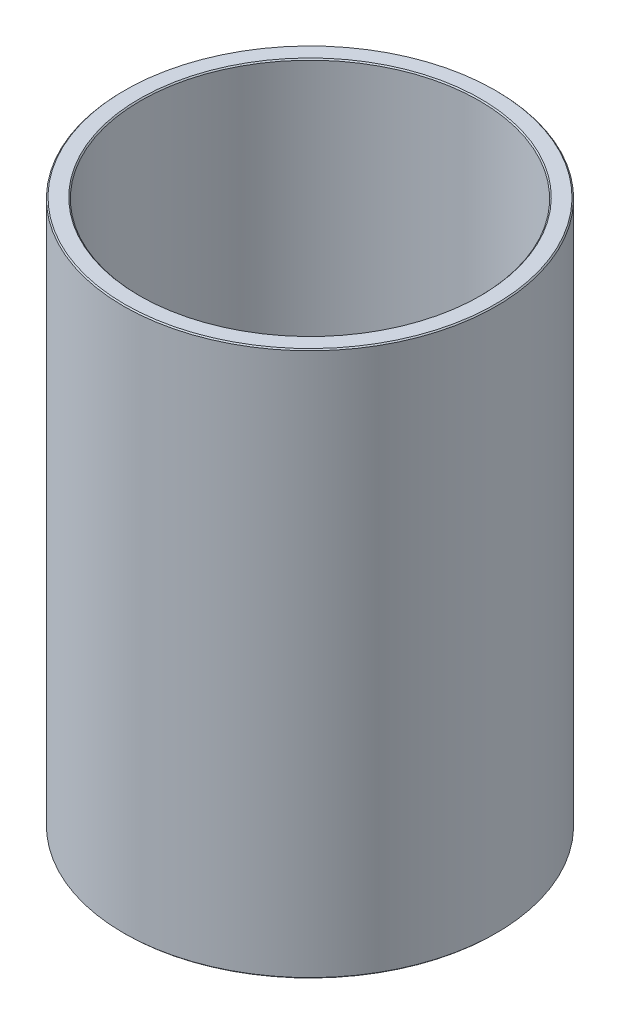
ISO-10303-21;
HEADER;
FILE_DESCRIPTION(('STEP AP214'),'2;1');
FILE_NAME('part.step','',(''),(''),'','','');
FILE_SCHEMA(('AUTOMOTIVE_DESIGN { 1 0 10303 214 1 1 1 1 }'));
ENDSEC;
DATA;
#1=APPLICATION_CONTEXT('core data for automotive mechanical design processes');
#2=APPLICATION_PROTOCOL_DEFINITION('international standard','automotive_design',2000,#1);
#3=PRODUCT_CONTEXT('',#1,'mechanical');
#4=PRODUCT('Part','Part','',(#3));
#5=PRODUCT_RELATED_PRODUCT_CATEGORY('part','',(#4));
#6=PRODUCT_DEFINITION_FORMATION('','',#4);
#7=PRODUCT_DEFINITION_CONTEXT('part definition',#1,'design');
#8=PRODUCT_DEFINITION('design','',#6,#7);
#9=PRODUCT_DEFINITION_SHAPE('','',#8);
#10=(LENGTH_UNIT() NAMED_UNIT(*) SI_UNIT(.MILLI.,.METRE.));
#11=(NAMED_UNIT(*) PLANE_ANGLE_UNIT() SI_UNIT($,.RADIAN.));
#12=(NAMED_UNIT(*) SI_UNIT($,.STERADIAN.) SOLID_ANGLE_UNIT());
#13=UNCERTAINTY_MEASURE_WITH_UNIT(LENGTH_MEASURE(1.E-05),#10,'distance_accuracy_value','');
#14=(GEOMETRIC_REPRESENTATION_CONTEXT(3) GLOBAL_UNCERTAINTY_ASSIGNED_CONTEXT((#13)) GLOBAL_UNIT_ASSIGNED_CONTEXT((#10,
#11,#12)) REPRESENTATION_CONTEXT('',''));
#15=CARTESIAN_POINT('',(0.,0.,0.));
#16=DIRECTION('',(0.,0.,1.));
#17=DIRECTION('',(1.,0.,0.));
#18=AXIS2_PLACEMENT_3D('',#15,#16,#17);
#19=CARTESIAN_POINT('',(30.,0.,0.));
#20=DIRECTION('',(0.,-1.,0.));
#21=DIRECTION('',(0.,0.,-1.));
#22=AXIS2_PLACEMENT_3D('',#19,#20,#21);
#23=PLANE('',#22);
#24=CARTESIAN_POINT('',(0.,0.,0.));
#25=DIRECTION('',(0.,-1.,0.));
#26=DIRECTION('',(0.,0.,-1.));
#27=AXIS2_PLACEMENT_3D('',#24,#25,#26);
#28=CIRCLE('',#27,30.2);
#29=CARTESIAN_POINT('',(0.,0.,-30.2));
#30=VERTEX_POINT('',#29);
#31=EDGE_CURVE('E62',#30,#30,#28,.F.);
#32=ORIENTED_EDGE('',*,*,#31,.T.);
#33=EDGE_LOOP('',(#32));
#34=FACE_BOUND('',#33,.T.);
#35=CARTESIAN_POINT('',(0.,0.,0.));
#36=DIRECTION('',(0.,-1.,0.));
#37=DIRECTION('',(0.,0.,-1.));
#38=AXIS2_PLACEMENT_3D('',#35,#36,#37);
#39=CIRCLE('',#38,32.8);
#40=CARTESIAN_POINT('',(0.,0.,-32.8));
#41=VERTEX_POINT('',#40);
#42=EDGE_CURVE('E65',#41,#41,#39,.T.);
#43=ORIENTED_EDGE('',*,*,#42,.T.);
#44=EDGE_LOOP('',(#43));
#45=FACE_BOUND('',#44,.T.);
#46=ADVANCED_FACE('F41',(#34,#45),#23,.T.);
#47=CARTESIAN_POINT('',(0.,0.,0.));
#48=DIRECTION('',(0.,-1.,0.));
#49=DIRECTION('',(0.,0.,-1.));
#50=AXIS2_PLACEMENT_3D('',#47,#48,#49);
#51=CYLINDRICAL_SURFACE('',#50,33.);
#52=CARTESIAN_POINT('',(0.,0.199999999999978,0.));
#53=DIRECTION('',(0.,-1.,0.));
#54=DIRECTION('',(0.,0.,-1.));
#55=AXIS2_PLACEMENT_3D('',#52,#53,#54);
#56=CIRCLE('',#55,33.);
#57=CARTESIAN_POINT('',(0.,0.199999999999978,-33.));
#58=VERTEX_POINT('',#57);
#59=EDGE_CURVE('E53',#58,#58,#56,.F.);
#60=CARTESIAN_POINT('',(0.,96.3,0.));
#61=DIRECTION('',(0.,1.,0.));
#62=DIRECTION('',(0.,0.,1.));
#63=AXIS2_PLACEMENT_3D('',#60,#61,#62);
#64=CIRCLE('',#63,33.);
#65=CARTESIAN_POINT('',(0.,96.3,-33.));
#66=VERTEX_POINT('',#65);
#67=EDGE_CURVE('E57',#66,#66,#64,.F.);
#68=CARTESIAN_POINT('',(0.,0.199999999999978,-33.));
#69=CARTESIAN_POINT('',(0.,1.20104166666665,-33.));
#70=CARTESIAN_POINT('',(0.,2.20208333333331,-33.));
#71=CARTESIAN_POINT('',(0.,4.20416666666665,-33.));
#72=CARTESIAN_POINT('',(0.,5.20520833333331,-33.));
#73=CARTESIAN_POINT('',(0.,7.20729166666665,-33.));
#74=CARTESIAN_POINT('',(0.,8.20833333333331,-33.));
#75=CARTESIAN_POINT('',(0.,10.2104166666666,-33.));
#76=CARTESIAN_POINT('',(0.,11.2114583333333,-33.));
#77=CARTESIAN_POINT('',(0.,13.2135416666667,-33.));
#78=CARTESIAN_POINT('',(0.,14.2145833333333,-33.));
#79=CARTESIAN_POINT('',(0.,16.2166666666667,-33.));
#80=CARTESIAN_POINT('',(0.,17.2177083333333,-33.));
#81=CARTESIAN_POINT('',(0.,19.2197916666667,-33.));
#82=CARTESIAN_POINT('',(0.,20.2208333333333,-33.));
#83=CARTESIAN_POINT('',(0.,22.2229166666667,-33.));
#84=CARTESIAN_POINT('',(0.,23.2239583333333,-33.));
#85=CARTESIAN_POINT('',(0.,25.2260416666667,-33.));
#86=CARTESIAN_POINT('',(0.,26.2270833333333,-33.));
#87=CARTESIAN_POINT('',(0.,28.2291666666667,-33.));
#88=CARTESIAN_POINT('',(0.,29.2302083333333,-33.));
#89=CARTESIAN_POINT('',(0.,31.2322916666667,-33.));
#90=CARTESIAN_POINT('',(0.,32.2333333333333,-33.));
#91=CARTESIAN_POINT('',(0.,34.2354166666667,-33.));
#92=CARTESIAN_POINT('',(0.,35.2364583333333,-33.));
#93=CARTESIAN_POINT('',(0.,37.2385416666667,-33.));
#94=CARTESIAN_POINT('',(0.,38.2395833333333,-33.));
#95=CARTESIAN_POINT('',(0.,40.2416666666667,-33.));
#96=CARTESIAN_POINT('',(0.,41.2427083333333,-33.));
#97=CARTESIAN_POINT('',(0.,43.2447916666667,-33.));
#98=CARTESIAN_POINT('',(0.,44.2458333333333,-33.));
#99=CARTESIAN_POINT('',(0.,46.2479166666667,-33.));
#100=CARTESIAN_POINT('',(0.,47.2489583333333,-33.));
#101=CARTESIAN_POINT('',(0.,49.2510416666667,-33.));
#102=CARTESIAN_POINT('',(0.,50.2520833333333,-33.));
#103=CARTESIAN_POINT('',(0.,52.2541666666667,-33.));
#104=CARTESIAN_POINT('',(0.,53.2552083333333,-33.));
#105=CARTESIAN_POINT('',(0.,55.2572916666667,-33.));
#106=CARTESIAN_POINT('',(0.,56.2583333333333,-33.));
#107=CARTESIAN_POINT('',(0.,58.2604166666667,-33.));
#108=CARTESIAN_POINT('',(0.,59.2614583333333,-33.));
#109=CARTESIAN_POINT('',(0.,61.2635416666667,-33.));
#110=CARTESIAN_POINT('',(0.,62.2645833333333,-33.));
#111=CARTESIAN_POINT('',(0.,64.2666666666667,-33.));
#112=CARTESIAN_POINT('',(0.,65.2677083333333,-33.));
#113=CARTESIAN_POINT('',(0.,67.2697916666667,-33.));
#114=CARTESIAN_POINT('',(0.,68.2708333333334,-33.));
#115=CARTESIAN_POINT('',(0.,70.2729166666667,-33.));
#116=CARTESIAN_POINT('',(0.,71.2739583333333,-33.));
#117=CARTESIAN_POINT('',(0.,73.2760416666667,-33.));
#118=CARTESIAN_POINT('',(0.,74.2770833333333,-33.));
#119=CARTESIAN_POINT('',(0.,76.2791666666667,-33.));
#120=CARTESIAN_POINT('',(0.,77.2802083333333,-33.));
#121=CARTESIAN_POINT('',(0.,79.2822916666667,-33.));
#122=CARTESIAN_POINT('',(0.,80.2833333333333,-33.));
#123=CARTESIAN_POINT('',(0.,82.2854166666667,-33.));
#124=CARTESIAN_POINT('',(0.,83.2864583333334,-33.));
#125=CARTESIAN_POINT('',(0.,85.2885416666667,-33.));
#126=CARTESIAN_POINT('',(0.,86.2895833333334,-33.));
#127=CARTESIAN_POINT('',(0.,88.2916666666667,-33.));
#128=CARTESIAN_POINT('',(0.,89.2927083333334,-33.));
#129=CARTESIAN_POINT('',(0.,91.2947916666667,-33.));
#130=CARTESIAN_POINT('',(0.,92.2958333333333,-33.));
#131=CARTESIAN_POINT('',(0.,94.2979166666667,-33.));
#132=CARTESIAN_POINT('',(0.,95.2989583333334,-33.));
#133=CARTESIAN_POINT('',(0.,96.3,-33.));
#134=B_SPLINE_CURVE_WITH_KNOTS('',3,(#68,#69,#70,#71,#72,#73,#74,#75,#76,#77,#78,#79,#80,#81,
#82,#83,#84,#85,#86,#87,#88,#89,#90,#91,#92,#93,#94,#95,#96,#97,#98,#99,#100,#101,#102,#103,
#104,#105,#106,#107,#108,#109,#110,#111,#112,#113,#114,#115,#116,#117,#118,#119,#120,#121,#122,
#123,#124,#125,#126,#127,#128,#129,#130,#131,#132,#133),.UNSPECIFIED.,.F.,.F.,(4,2,2,2,2,2,2,2,
2,2,2,2,2,2,2,2,2,2,2,2,2,2,2,2,2,2,2,2,2,2,2,2,4),(0.,3.003125,6.00625,9.009375,12.0125,
15.015625,18.01875,21.021875,24.025,27.028125,30.03125,33.034375,36.0375,39.040625,42.04375,
45.046875,48.05,51.053125,54.05625,57.059375,60.0625,63.065625,66.06875,69.071875,72.075,
75.078125,78.08125,81.084375,84.0875,87.090625,90.09375,93.0968750000001,96.1000000000001),.UNSPECIFIED.);
#135=EDGE_CURVE('BSEAM91',#58,#66,#134,.T.);
#136=ORIENTED_EDGE('',*,*,#59,.T.);
#137=ORIENTED_EDGE('',*,*,#67,.T.);
#138=ORIENTED_EDGE('',*,*,#135,.T.);
#139=ORIENTED_EDGE('',*,*,#135,.F.);
#140=EDGE_LOOP('',(#136,#138,#137,#139));
#141=FACE_BOUND('',#140,.T.);
#142=ADVANCED_FACE('F91',(#141),#51,.T.);
#143=CARTESIAN_POINT('',(33.,96.5,0.));
#144=DIRECTION('',(0.,1.,0.));
#145=DIRECTION('',(0.,0.,1.));
#146=AXIS2_PLACEMENT_3D('',#143,#144,#145);
#147=PLANE('',#146);
#148=CARTESIAN_POINT('',(0.,96.5,0.));
#149=DIRECTION('',(0.,1.,0.));
#150=DIRECTION('',(0.,0.,1.));
#151=AXIS2_PLACEMENT_3D('',#148,#149,#150);
#152=CIRCLE('',#151,30.2);
#153=CARTESIAN_POINT('',(0.,96.5,30.2));
#154=VERTEX_POINT('',#153);
#155=EDGE_CURVE('E10',#154,#154,#152,.F.);
#156=ORIENTED_EDGE('',*,*,#155,.T.);
#157=EDGE_LOOP('',(#156));
#158=FACE_BOUND('',#157,.T.);
#159=CARTESIAN_POINT('',(0.,96.5,0.));
#160=DIRECTION('',(0.,1.,0.));
#161=DIRECTION('',(0.,0.,1.));
#162=AXIS2_PLACEMENT_3D('',#159,#160,#161);
#163=CIRCLE('',#162,32.8);
#164=CARTESIAN_POINT('',(0.,96.5,-32.8));
#165=VERTEX_POINT('',#164);
#166=EDGE_CURVE('E49',#165,#165,#163,.T.);
#167=ORIENTED_EDGE('',*,*,#166,.T.);
#168=EDGE_LOOP('',(#167));
#169=FACE_BOUND('',#168,.T.);
#170=ADVANCED_FACE('F97',(#158,#169),#147,.T.);
#171=CARTESIAN_POINT('',(0.,0.,0.));
#172=DIRECTION('',(0.,-1.,0.));
#173=DIRECTION('',(0.,0.,-1.));
#174=AXIS2_PLACEMENT_3D('',#171,#172,#173);
#175=CYLINDRICAL_SURFACE('',#174,30.);
#176=CARTESIAN_POINT('',(0.,0.200000000000002,0.));
#177=DIRECTION('',(0.,-1.,0.));
#178=DIRECTION('',(0.,0.,-1.));
#179=AXIS2_PLACEMENT_3D('',#176,#177,#178);
#180=CIRCLE('',#179,30.);
#181=CARTESIAN_POINT('',(0.,0.200000000000002,-30.));
#182=VERTEX_POINT('',#181);
#183=EDGE_CURVE('E68',#182,#182,#180,.T.);
#184=ORIENTED_EDGE('',*,*,#183,.T.);
#185=EDGE_LOOP('',(#184));
#186=FACE_BOUND('',#185,.T.);
#187=CARTESIAN_POINT('',(0.,96.3,0.));
#188=DIRECTION('',(0.,1.,0.));
#189=DIRECTION('',(0.,0.,1.));
#190=AXIS2_PLACEMENT_3D('',#187,#188,#189);
#191=CIRCLE('',#190,30.);
#192=CARTESIAN_POINT('',(0.,96.3,30.));
#193=VERTEX_POINT('',#192);
#194=EDGE_CURVE('E71',#193,#193,#191,.T.);
#195=ORIENTED_EDGE('',*,*,#194,.T.);
#196=EDGE_LOOP('',(#195));
#197=FACE_BOUND('',#196,.T.);
#198=ADVANCED_FACE('F75',(#186,#197),#175,.F.);
#199=CARTESIAN_POINT('',(0.,0.200000000000002,0.));
#200=DIRECTION('',(0.,-1.,0.));
#201=DIRECTION('',(0.,0.,-1.));
#202=AXIS2_PLACEMENT_3D('',#199,#200,#201);
#203=CONICAL_SURFACE('',#202,30.,0.785398163397396);
#204=ORIENTED_EDGE('',*,*,#31,.F.);
#205=EDGE_LOOP('',(#204));
#206=FACE_BOUND('',#205,.T.);
#207=ORIENTED_EDGE('',*,*,#183,.F.);
#208=EDGE_LOOP('',(#207));
#209=FACE_BOUND('',#208,.T.);
#210=ADVANCED_FACE('F86',(#206,#209),#203,.F.);
#211=CARTESIAN_POINT('',(0.,0.,0.));
#212=DIRECTION('',(0.,1.,0.));
#213=DIRECTION('',(0.,0.,1.));
#214=AXIS2_PLACEMENT_3D('',#211,#212,#213);
#215=CONICAL_SURFACE('',#214,32.8,0.785398163397414);
#216=ORIENTED_EDGE('',*,*,#59,.F.);
#217=EDGE_LOOP('',(#216));
#218=FACE_BOUND('',#217,.T.);
#219=ORIENTED_EDGE('',*,*,#42,.F.);
#220=EDGE_LOOP('',(#219));
#221=FACE_BOUND('',#220,.T.);
#222=ADVANCED_FACE('F80',(#218,#221),#215,.T.);
#223=CARTESIAN_POINT('',(0.,96.5,0.));
#224=DIRECTION('',(0.,1.,0.));
#225=DIRECTION('',(0.,0.,1.));
#226=AXIS2_PLACEMENT_3D('',#223,#224,#225);
#227=CONICAL_SURFACE('',#226,30.2,0.785398163397457);
#228=CARTESIAN_POINT('',(0.,96.3,30.));
#229=CARTESIAN_POINT('',(0.,96.3020833333333,30.0020833333333));
#230=CARTESIAN_POINT('',(0.,96.3041666666667,30.0041666666667));
#231=CARTESIAN_POINT('',(0.,96.3083333333333,30.0083333333333));
#232=CARTESIAN_POINT('',(0.,96.3104166666667,30.0104166666667));
#233=CARTESIAN_POINT('',(0.,96.3145833333333,30.0145833333333));
#234=CARTESIAN_POINT('',(0.,96.3166666666667,30.0166666666667));
#235=CARTESIAN_POINT('',(0.,96.3208333333333,30.0208333333333));
#236=CARTESIAN_POINT('',(0.,96.3229166666667,30.0229166666667));
#237=CARTESIAN_POINT('',(0.,96.3270833333333,30.0270833333333));
#238=CARTESIAN_POINT('',(0.,96.3291666666667,30.0291666666667));
#239=CARTESIAN_POINT('',(0.,96.3333333333333,30.0333333333333));
#240=CARTESIAN_POINT('',(0.,96.3354166666667,30.0354166666667));
#241=CARTESIAN_POINT('',(0.,96.3395833333333,30.0395833333333));
#242=CARTESIAN_POINT('',(0.,96.3416666666667,30.0416666666667));
#243=CARTESIAN_POINT('',(0.,96.3458333333333,30.0458333333333));
#244=CARTESIAN_POINT('',(0.,96.3479166666667,30.0479166666667));
#245=CARTESIAN_POINT('',(0.,96.3520833333333,30.0520833333333));
#246=CARTESIAN_POINT('',(0.,96.3541666666667,30.0541666666666));
#247=CARTESIAN_POINT('',(0.,96.3583333333333,30.0583333333333));
#248=CARTESIAN_POINT('',(0.,96.3604166666667,30.0604166666666));
#249=CARTESIAN_POINT('',(0.,96.3645833333333,30.0645833333333));
#250=CARTESIAN_POINT('',(0.,96.3666666666667,30.0666666666667));
#251=CARTESIAN_POINT('',(0.,96.3708333333333,30.0708333333333));
#252=CARTESIAN_POINT('',(0.,96.3729166666667,30.0729166666666));
#253=CARTESIAN_POINT('',(0.,96.3770833333333,30.0770833333333));
#254=CARTESIAN_POINT('',(0.,96.3791666666667,30.0791666666666));
#255=CARTESIAN_POINT('',(0.,96.3833333333333,30.0833333333333));
#256=CARTESIAN_POINT('',(0.,96.3854166666667,30.0854166666666));
#257=CARTESIAN_POINT('',(0.,96.3895833333333,30.0895833333333));
#258=CARTESIAN_POINT('',(0.,96.3916666666667,30.0916666666666));
#259=CARTESIAN_POINT('',(0.,96.3958333333333,30.0958333333333));
#260=CARTESIAN_POINT('',(0.,96.3979166666667,30.0979166666666));
#261=CARTESIAN_POINT('',(0.,96.4020833333333,30.1020833333333));
#262=CARTESIAN_POINT('',(0.,96.4041666666667,30.1041666666666));
#263=CARTESIAN_POINT('',(0.,96.4083333333333,30.1083333333333));
#264=CARTESIAN_POINT('',(0.,96.4104166666667,30.1104166666666));
#265=CARTESIAN_POINT('',(0.,96.4145833333333,30.1145833333333));
#266=CARTESIAN_POINT('',(0.,96.4166666666667,30.1166666666666));
#267=CARTESIAN_POINT('',(0.,96.4208333333333,30.1208333333333));
#268=CARTESIAN_POINT('',(0.,96.4229166666667,30.1229166666666));
#269=CARTESIAN_POINT('',(0.,96.4270833333333,30.1270833333333));
#270=CARTESIAN_POINT('',(0.,96.4291666666667,30.1291666666666));
#271=CARTESIAN_POINT('',(0.,96.4333333333333,30.1333333333333));
#272=CARTESIAN_POINT('',(0.,96.4354166666667,30.1354166666666));
#273=CARTESIAN_POINT('',(0.,96.4395833333333,30.1395833333333));
#274=CARTESIAN_POINT('',(0.,96.4416666666667,30.1416666666666));
#275=CARTESIAN_POINT('',(0.,96.4458333333333,30.1458333333333));
#276=CARTESIAN_POINT('',(0.,96.4479166666667,30.1479166666666));
#277=CARTESIAN_POINT('',(0.,96.4520833333333,30.1520833333333));
#278=CARTESIAN_POINT('',(0.,96.4541666666667,30.1541666666666));
#279=CARTESIAN_POINT('',(0.,96.4583333333333,30.1583333333333));
#280=CARTESIAN_POINT('',(0.,96.4604166666667,30.1604166666666));
#281=CARTESIAN_POINT('',(0.,96.4645833333333,30.1645833333333));
#282=CARTESIAN_POINT('',(0.,96.4666666666667,30.1666666666666));
#283=CARTESIAN_POINT('',(0.,96.4708333333333,30.1708333333333));
#284=CARTESIAN_POINT('',(0.,96.4729166666667,30.1729166666666));
#285=CARTESIAN_POINT('',(0.,96.4770833333333,30.1770833333333));
#286=CARTESIAN_POINT('',(0.,96.4791666666667,30.1791666666666));
#287=CARTESIAN_POINT('',(0.,96.4833333333333,30.1833333333333));
#288=CARTESIAN_POINT('',(0.,96.4854166666667,30.1854166666666));
#289=CARTESIAN_POINT('',(0.,96.4895833333333,30.1895833333333));
#290=CARTESIAN_POINT('',(0.,96.4916666666667,30.1916666666666));
#291=CARTESIAN_POINT('',(0.,96.4958333333333,30.1958333333333));
#292=CARTESIAN_POINT('',(0.,96.4979166666667,30.1979166666666));
#293=CARTESIAN_POINT('',(0.,96.5,30.2));
#294=B_SPLINE_CURVE_WITH_KNOTS('',3,(#228,#229,#230,#231,#232,#233,#234,#235,#236,#237,#238,
#239,#240,#241,#242,#243,#244,#245,#246,#247,#248,#249,#250,#251,#252,#253,#254,#255,#256,#257,
#258,#259,#260,#261,#262,#263,#264,#265,#266,#267,#268,#269,#270,#271,#272,#273,#274,#275,#276,
#277,#278,#279,#280,#281,#282,#283,#284,#285,#286,#287,#288,#289,#290,#291,#292,#293),
.UNSPECIFIED.,.F.,.F.,(4,2,2,2,2,2,2,2,2,2,2,2,2,2,2,2,2,2,2,2,2,2,2,2,2,2,2,2,2,2,2,2,4),(0.,
0.00883883476483087,0.0176776695296617,0.0265165042944926,0.0353553390593235,0.0441941738241543,
0.0530330085889852,0.0618718433538161,0.070710678118647,0.0795495128834778,0.0883883476483087,
0.0972271824131395,0.10606601717798,0.114904851942801,0.123743686707632,0.132582521472463,
0.141421356237294,0.150260191002127,0.159099025766958,0.167937860531789,0.17677669529662,
0.185615530061451,0.194454364826282,0.203293199591113,0.212132034355953,0.220970869120784,
0.229809703885615,0.238648538650446,0.247487373415277,0.256326208180108,0.265165042944938,
0.274003877709769,0.2828427124746),.UNSPECIFIED.);
#295=EDGE_CURVE('BSEAM77',#193,#154,#294,.T.);
#296=ORIENTED_EDGE('',*,*,#194,.F.);
#297=ORIENTED_EDGE('',*,*,#155,.F.);
#298=ORIENTED_EDGE('',*,*,#295,.T.);
#299=ORIENTED_EDGE('',*,*,#295,.F.);
#300=EDGE_LOOP('',(#296,#298,#297,#299));
#301=FACE_BOUND('',#300,.T.);
#302=ADVANCED_FACE('F77',(#301),#227,.F.);
#303=CARTESIAN_POINT('',(0.,96.3,0.));
#304=DIRECTION('',(0.,-1.,0.));
#305=DIRECTION('',(0.,0.,-1.));
#306=AXIS2_PLACEMENT_3D('',#303,#304,#305);
#307=CONICAL_SURFACE('',#306,33.,0.785398163397466);
#308=CARTESIAN_POINT('',(0.,96.5,-32.8));
#309=CARTESIAN_POINT('',(0.,96.4979166666667,-32.8020833333334));
#310=CARTESIAN_POINT('',(0.,96.4958333333333,-32.8041666666667));
#311=CARTESIAN_POINT('',(0.,96.4916666666667,-32.8083333333334));
#312=CARTESIAN_POINT('',(0.,96.4895833333333,-32.8104166666667));
#313=CARTESIAN_POINT('',(0.,96.4854166666667,-32.8145833333334));
#314=CARTESIAN_POINT('',(0.,96.4833333333333,-32.8166666666667));
#315=CARTESIAN_POINT('',(0.,96.4791666666667,-32.8208333333334));
#316=CARTESIAN_POINT('',(0.,96.4770833333333,-32.8229166666667));
#317=CARTESIAN_POINT('',(0.,96.4729166666667,-32.8270833333334));
#318=CARTESIAN_POINT('',(0.,96.4708333333333,-32.8291666666667));
#319=CARTESIAN_POINT('',(0.,96.4666666666667,-32.8333333333333));
#320=CARTESIAN_POINT('',(0.,96.4645833333333,-32.8354166666667));
#321=CARTESIAN_POINT('',(0.,96.4604166666667,-32.8395833333334));
#322=CARTESIAN_POINT('',(0.,96.4583333333333,-32.8416666666667));
#323=CARTESIAN_POINT('',(0.,96.4541666666667,-32.8458333333334));
#324=CARTESIAN_POINT('',(0.,96.4520833333333,-32.8479166666667));
#325=CARTESIAN_POINT('',(0.,96.4479166666667,-32.8520833333334));
#326=CARTESIAN_POINT('',(0.,96.4458333333333,-32.8541666666667));
#327=CARTESIAN_POINT('',(0.,96.4416666666667,-32.8583333333333));
#328=CARTESIAN_POINT('',(0.,96.4395833333333,-32.8604166666667));
#329=CARTESIAN_POINT('',(0.,96.4354166666667,-32.8645833333333));
#330=CARTESIAN_POINT('',(0.,96.4333333333333,-32.8666666666667));
#331=CARTESIAN_POINT('',(0.,96.4291666666667,-32.8708333333334));
#332=CARTESIAN_POINT('',(0.,96.4270833333333,-32.8729166666667));
#333=CARTESIAN_POINT('',(0.,96.4229166666667,-32.8770833333333));
#334=CARTESIAN_POINT('',(0.,96.4208333333333,-32.8791666666667));
#335=CARTESIAN_POINT('',(0.,96.4166666666667,-32.8833333333333));
#336=CARTESIAN_POINT('',(0.,96.4145833333333,-32.8854166666667));
#337=CARTESIAN_POINT('',(0.,96.4104166666667,-32.8895833333333));
#338=CARTESIAN_POINT('',(0.,96.4083333333333,-32.8916666666667));
#339=CARTESIAN_POINT('',(0.,96.4041666666667,-32.8958333333333));
#340=CARTESIAN_POINT('',(0.,96.4020833333333,-32.8979166666667));
#341=CARTESIAN_POINT('',(0.,96.3979166666667,-32.9020833333333));
#342=CARTESIAN_POINT('',(0.,96.3958333333333,-32.9041666666667));
#343=CARTESIAN_POINT('',(0.,96.3916666666667,-32.9083333333334));
#344=CARTESIAN_POINT('',(0.,96.3895833333333,-32.9104166666667));
#345=CARTESIAN_POINT('',(0.,96.3854166666667,-32.9145833333334));
#346=CARTESIAN_POINT('',(0.,96.3833333333333,-32.9166666666667));
#347=CARTESIAN_POINT('',(0.,96.3791666666667,-32.9208333333333));
#348=CARTESIAN_POINT('',(0.,96.3770833333333,-32.9229166666667));
#349=CARTESIAN_POINT('',(0.,96.3729166666667,-32.9270833333333));
#350=CARTESIAN_POINT('',(0.,96.3708333333333,-32.9291666666667));
#351=CARTESIAN_POINT('',(0.,96.3666666666667,-32.9333333333334));
#352=CARTESIAN_POINT('',(0.,96.3645833333333,-32.9354166666667));
#353=CARTESIAN_POINT('',(0.,96.3604166666667,-32.9395833333333));
#354=CARTESIAN_POINT('',(0.,96.3583333333333,-32.9416666666667));
#355=CARTESIAN_POINT('',(0.,96.3541666666667,-32.9458333333333));
#356=CARTESIAN_POINT('',(0.,96.3520833333333,-32.9479166666667));
#357=CARTESIAN_POINT('',(0.,96.3479166666667,-32.9520833333333));
#358=CARTESIAN_POINT('',(0.,96.3458333333333,-32.9541666666667));
#359=CARTESIAN_POINT('',(0.,96.3416666666667,-32.9583333333333));
#360=CARTESIAN_POINT('',(0.,96.3395833333333,-32.9604166666667));
#361=CARTESIAN_POINT('',(0.,96.3354166666667,-32.9645833333333));
#362=CARTESIAN_POINT('',(0.,96.3333333333333,-32.9666666666667));
#363=CARTESIAN_POINT('',(0.,96.3291666666667,-32.9708333333333));
#364=CARTESIAN_POINT('',(0.,96.3270833333333,-32.9729166666667));
#365=CARTESIAN_POINT('',(0.,96.3229166666667,-32.9770833333333));
#366=CARTESIAN_POINT('',(0.,96.3208333333333,-32.9791666666667));
#367=CARTESIAN_POINT('',(0.,96.3166666666667,-32.9833333333333));
#368=CARTESIAN_POINT('',(0.,96.3145833333333,-32.9854166666667));
#369=CARTESIAN_POINT('',(0.,96.3104166666667,-32.9895833333333));
#370=CARTESIAN_POINT('',(0.,96.3083333333333,-32.9916666666667));
#371=CARTESIAN_POINT('',(0.,96.3041666666667,-32.9958333333333));
#372=CARTESIAN_POINT('',(0.,96.3020833333334,-32.9979166666667));
#373=CARTESIAN_POINT('',(0.,96.3,-33.));
#374=B_SPLINE_CURVE_WITH_KNOTS('',3,(#308,#309,#310,#311,#312,#313,#314,#315,#316,#317,#318,
#319,#320,#321,#322,#323,#324,#325,#326,#327,#328,#329,#330,#331,#332,#333,#334,#335,#336,#337,
#338,#339,#340,#341,#342,#343,#344,#345,#346,#347,#348,#349,#350,#351,#352,#353,#354,#355,#356,
#357,#358,#359,#360,#361,#362,#363,#364,#365,#366,#367,#368,#369,#370,#371,#372,#373),
.UNSPECIFIED.,.F.,.F.,(4,2,2,2,2,2,2,2,2,2,2,2,2,2,2,2,2,2,2,2,2,2,2,2,2,2,2,2,2,2,2,2,4),(0.,
0.00883883476483087,0.0176776695296617,0.0265165042944926,0.0353553390593235,0.0441941738241543,
0.0530330085889852,0.0618718433538161,0.070710678118647,0.0795495128834778,0.0883883476483087,
0.0972271824131395,0.10606601717797,0.114904851942801,0.123743686707632,0.132582521472463,
0.141421356237294,0.15026019100213,0.159099025766961,0.167937860531791,0.176776695296622,
0.185615530061453,0.194454364826284,0.203293199591115,0.212132034355946,0.220970869120777,
0.229809703885608,0.238648538650439,0.247487373415269,0.2563262081801,0.265165042944931,
0.274003877709762,0.282842712474583),.UNSPECIFIED.);
#375=EDGE_CURVE('BSEAM44',#165,#66,#374,.T.);
#376=ORIENTED_EDGE('',*,*,#166,.F.);
#377=ORIENTED_EDGE('',*,*,#67,.F.);
#378=ORIENTED_EDGE('',*,*,#375,.T.);
#379=ORIENTED_EDGE('',*,*,#375,.F.);
#380=EDGE_LOOP('',(#376,#378,#377,#379));
#381=FACE_BOUND('',#380,.T.);
#382=ADVANCED_FACE('F44',(#381),#307,.T.);
#383=CLOSED_SHELL('',(#46,#142,#170,#198,#210,#222,#302,#382));
#384=MANIFOLD_SOLID_BREP('B2',#383);
#385=ADVANCED_BREP_SHAPE_REPRESENTATION('',(#18,#384),#14);
#386=SHAPE_DEFINITION_REPRESENTATION(#9,#385);
ENDSEC;
END-ISO-10303-21;
